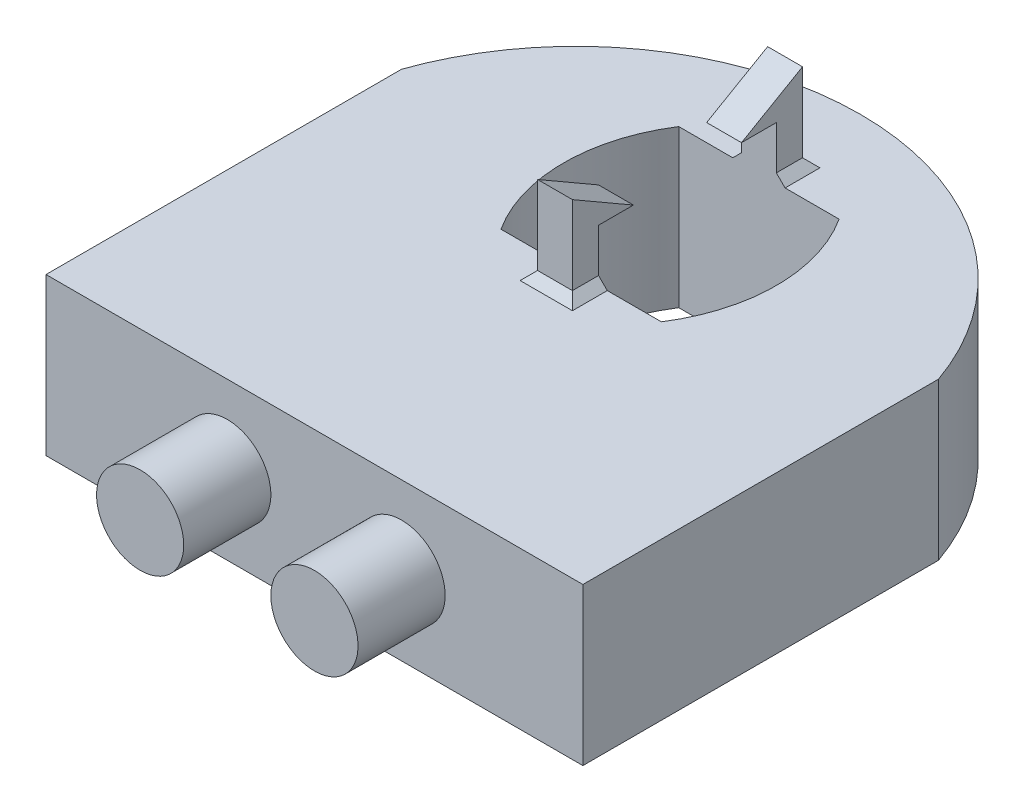
ISO-10303-21;
HEADER;
FILE_DESCRIPTION(('STEP AP214'),'2;1');
FILE_NAME('part.step','',(''),(''),'','','');
FILE_SCHEMA(('AUTOMOTIVE_DESIGN { 1 0 10303 214 1 1 1 1 }'));
ENDSEC;
DATA;
#1=APPLICATION_CONTEXT('core data for automotive mechanical design processes');
#2=APPLICATION_PROTOCOL_DEFINITION('international standard','automotive_design',2000,#1);
#3=PRODUCT_CONTEXT('',#1,'mechanical');
#4=PRODUCT('Part','Part','',(#3));
#5=PRODUCT_RELATED_PRODUCT_CATEGORY('part','',(#4));
#6=PRODUCT_DEFINITION_FORMATION('','',#4);
#7=PRODUCT_DEFINITION_CONTEXT('part definition',#1,'design');
#8=PRODUCT_DEFINITION('design','',#6,#7);
#9=PRODUCT_DEFINITION_SHAPE('','',#8);
#10=(LENGTH_UNIT() NAMED_UNIT(*) SI_UNIT(.MILLI.,.METRE.));
#11=(NAMED_UNIT(*) PLANE_ANGLE_UNIT() SI_UNIT($,.RADIAN.));
#12=(NAMED_UNIT(*) SI_UNIT($,.STERADIAN.) SOLID_ANGLE_UNIT());
#13=UNCERTAINTY_MEASURE_WITH_UNIT(LENGTH_MEASURE(1.E-05),#10,'distance_accuracy_value','');
#14=(GEOMETRIC_REPRESENTATION_CONTEXT(3) GLOBAL_UNCERTAINTY_ASSIGNED_CONTEXT((#13)) GLOBAL_UNIT_ASSIGNED_CONTEXT((#10,
#11,#12)) REPRESENTATION_CONTEXT('',''));
#15=CARTESIAN_POINT('',(0.,0.,0.));
#16=DIRECTION('',(0.,0.,1.));
#17=DIRECTION('',(1.,0.,0.));
#18=AXIS2_PLACEMENT_3D('',#15,#16,#17);
#19=CARTESIAN_POINT('',(0.,9.,0.));
#20=DIRECTION('',(0.,1.,0.));
#21=DIRECTION('',(0.,0.,1.));
#22=AXIS2_PLACEMENT_3D('',#19,#20,#21);
#23=PLANE('',#22);
#24=CARTESIAN_POINT('',(15.4,9.,-15.));
#25=DIRECTION('',(0.,1.,0.));
#26=DIRECTION('',(0.,0.,1.));
#27=AXIS2_PLACEMENT_3D('',#24,#25,#26);
#28=CIRCLE('',#27,16.3193137110603);
#29=CARTESIAN_POINT('',(0.,9.,-20.4));
#30=VERTEX_POINT('',#29);
#31=CARTESIAN_POINT('',(30.8,9.,-20.4));
#32=VERTEX_POINT('',#31);
#33=EDGE_CURVE('E307',#30,#32,#28,.F.);
#34=ORIENTED_EDGE('',*,*,#33,.F.);
#35=DIRECTION('',(0.,0.,-1.));
#36=VECTOR('',#35,1.);
#37=CARTESIAN_POINT('',(0.,9.,0.));
#38=LINE('',#37,#36);
#39=CARTESIAN_POINT('',(0.,9.,0.));
#40=VERTEX_POINT('',#39);
#41=EDGE_CURVE('E311',#40,#30,#38,.T.);
#42=ORIENTED_EDGE('',*,*,#41,.F.);
#43=DIRECTION('',(1.,0.,0.));
#44=VECTOR('',#43,1.);
#45=CARTESIAN_POINT('',(0.,9.,0.));
#46=LINE('',#45,#44);
#47=CARTESIAN_POINT('',(30.8,9.,0.));
#48=VERTEX_POINT('',#47);
#49=EDGE_CURVE('E315',#40,#48,#46,.T.);
#50=ORIENTED_EDGE('',*,*,#49,.T.);
#51=DIRECTION('',(0.,0.,-1.));
#52=VECTOR('',#51,1.);
#53=CARTESIAN_POINT('',(30.8,9.,0.));
#54=LINE('',#53,#52);
#55=EDGE_CURVE('E319',#48,#32,#54,.T.);
#56=ORIENTED_EDGE('',*,*,#55,.T.);
#57=EDGE_LOOP('',(#34,#42,#50,#56));
#58=FACE_BOUND('',#57,.T.);
#59=DIRECTION('',(1.,0.,0.));
#60=VECTOR('',#59,1.);
#61=CARTESIAN_POINT('',(0.,9.,-27.5));
#62=LINE('',#61,#60);
#63=CARTESIAN_POINT('',(13.9,9.,-27.5));
#64=VERTEX_POINT('',#63);
#65=CARTESIAN_POINT('',(16.9,9.,-27.5));
#66=VERTEX_POINT('',#65);
#67=EDGE_CURVE('E402',#64,#66,#62,.T.);
#68=ORIENTED_EDGE('',*,*,#67,.T.);
#69=DIRECTION('',(0.,0.,1.));
#70=VECTOR('',#69,1.);
#71=CARTESIAN_POINT('',(16.9,9.,0.));
#72=LINE('',#71,#70);
#73=CARTESIAN_POINT('',(16.9,9.,-25.5));
#74=VERTEX_POINT('',#73);
#75=EDGE_CURVE('E405',#66,#74,#72,.T.);
#76=ORIENTED_EDGE('',*,*,#75,.T.);
#77=DIRECTION('',(1.,0.,0.));
#78=VECTOR('',#77,1.);
#79=CARTESIAN_POINT('',(0.,9.,-25.5));
#80=LINE('',#79,#78);
#81=CARTESIAN_POINT('',(20.,9.,-25.5));
#82=VERTEX_POINT('',#81);
#83=EDGE_CURVE('E302',#74,#82,#80,.T.);
#84=ORIENTED_EDGE('',*,*,#83,.T.);
#85=CARTESIAN_POINT('',(12.08,9.,-20.4));
#86=DIRECTION('',(0.,1.,0.));
#87=DIRECTION('',(0.,0.,1.));
#88=AXIS2_PLACEMENT_3D('',#85,#86,#87);
#89=CIRCLE('',#88,9.42000000000002);
#90=CARTESIAN_POINT('',(20.,9.,-15.3));
#91=VERTEX_POINT('',#90);
#92=EDGE_CURVE('E288',#82,#91,#89,.F.);
#93=ORIENTED_EDGE('',*,*,#92,.T.);
#94=DIRECTION('',(1.,0.,0.));
#95=VECTOR('',#94,1.);
#96=CARTESIAN_POINT('',(0.,9.,-15.3));
#97=LINE('',#96,#95);
#98=CARTESIAN_POINT('',(16.9,9.,-15.3));
#99=VERTEX_POINT('',#98);
#100=EDGE_CURVE('E292',#99,#91,#97,.T.);
#101=ORIENTED_EDGE('',*,*,#100,.F.);
#102=DIRECTION('',(0.,0.,1.));
#103=VECTOR('',#102,1.);
#104=CARTESIAN_POINT('',(16.9,9.,-13.8));
#105=LINE('',#104,#103);
#106=CARTESIAN_POINT('',(16.9,9.,-13.3));
#107=VERTEX_POINT('',#106);
#108=EDGE_CURVE('E389',#99,#107,#105,.T.);
#109=ORIENTED_EDGE('',*,*,#108,.T.);
#110=DIRECTION('',(-1.,0.,0.));
#111=VECTOR('',#110,1.);
#112=CARTESIAN_POINT('',(0.,9.,-13.3));
#113=LINE('',#112,#111);
#114=CARTESIAN_POINT('',(13.9,9.,-13.3));
#115=VERTEX_POINT('',#114);
#116=EDGE_CURVE('E392',#107,#115,#113,.T.);
#117=ORIENTED_EDGE('',*,*,#116,.T.);
#118=DIRECTION('',(0.,0.,-1.));
#119=VECTOR('',#118,1.);
#120=CARTESIAN_POINT('',(13.9,9.,0.));
#121=LINE('',#120,#119);
#122=CARTESIAN_POINT('',(13.9,9.,-15.3));
#123=VERTEX_POINT('',#122);
#124=EDGE_CURVE('E395',#115,#123,#121,.T.);
#125=ORIENTED_EDGE('',*,*,#124,.T.);
#126=CARTESIAN_POINT('',(10.8,9.,-15.3));
#127=VERTEX_POINT('',#126);
#128=EDGE_CURVE('E294',#127,#123,#97,.T.);
#129=ORIENTED_EDGE('',*,*,#128,.F.);
#130=CARTESIAN_POINT('',(18.72,9.,-20.4));
#131=DIRECTION('',(0.,1.,0.));
#132=DIRECTION('',(0.,0.,1.));
#133=AXIS2_PLACEMENT_3D('',#130,#131,#132);
#134=CIRCLE('',#133,9.42000000000002);
#135=CARTESIAN_POINT('',(10.8,9.,-25.5));
#136=VERTEX_POINT('',#135);
#137=EDGE_CURVE('E298',#136,#127,#134,.T.);
#138=ORIENTED_EDGE('',*,*,#137,.F.);
#139=CARTESIAN_POINT('',(13.9,9.,-25.5));
#140=VERTEX_POINT('',#139);
#141=EDGE_CURVE('E303',#136,#140,#80,.T.);
#142=ORIENTED_EDGE('',*,*,#141,.T.);
#143=DIRECTION('',(0.,0.,-1.));
#144=VECTOR('',#143,1.);
#145=CARTESIAN_POINT('',(13.9,9.,-27.));
#146=LINE('',#145,#144);
#147=EDGE_CURVE('E399',#140,#64,#146,.T.);
#148=ORIENTED_EDGE('',*,*,#147,.T.);
#149=EDGE_LOOP('',(#68,#76,#84,#93,#101,#109,#117,#125,#129,#138,#142,#148));
#150=FACE_BOUND('',#149,.T.);
#151=ADVANCED_FACE('F49',(#58,#150),#23,.T.);
#152=CARTESIAN_POINT('',(15.4,9.,-15.));
#153=DIRECTION('',(0.,-1.,0.));
#154=DIRECTION('',(0.,0.,-1.));
#155=AXIS2_PLACEMENT_3D('',#152,#153,#154);
#156=CYLINDRICAL_SURFACE('',#155,16.3193137110603);
#157=CARTESIAN_POINT('',(15.4,0.,-15.));
#158=DIRECTION('',(0.,1.,0.));
#159=DIRECTION('',(0.,0.,1.));
#160=AXIS2_PLACEMENT_3D('',#157,#158,#159);
#161=CIRCLE('',#160,16.3193137110603);
#162=CARTESIAN_POINT('',(0.,0.,-20.4));
#163=VERTEX_POINT('',#162);
#164=CARTESIAN_POINT('',(30.8,0.,-20.4));
#165=VERTEX_POINT('',#164);
#166=EDGE_CURVE('E337',#163,#165,#161,.F.);
#167=ORIENTED_EDGE('',*,*,#166,.F.);
#168=DIRECTION('',(0.,-1.,0.));
#169=VECTOR('',#168,1.);
#170=CARTESIAN_POINT('',(0.,9.,-20.4));
#171=LINE('',#170,#169);
#172=EDGE_CURVE('E363',#30,#163,#171,.T.);
#173=ORIENTED_EDGE('',*,*,#172,.F.);
#174=ORIENTED_EDGE('',*,*,#33,.T.);
#175=DIRECTION('',(0.,-1.,0.));
#176=VECTOR('',#175,1.);
#177=CARTESIAN_POINT('',(30.8,9.,-20.4));
#178=LINE('',#177,#176);
#179=EDGE_CURVE('E352',#32,#165,#178,.T.);
#180=ORIENTED_EDGE('',*,*,#179,.T.);
#181=EDGE_LOOP('',(#167,#173,#174,#180));
#182=FACE_BOUND('',#181,.T.);
#183=ADVANCED_FACE('F494',(#182),#156,.T.);
#184=CARTESIAN_POINT('',(0.,9.,0.));
#185=DIRECTION('',(-1.,0.,0.));
#186=DIRECTION('',(0.,0.,1.));
#187=AXIS2_PLACEMENT_3D('',#184,#185,#186);
#188=PLANE('',#187);
#189=DIRECTION('',(0.,0.,-1.));
#190=VECTOR('',#189,1.);
#191=CARTESIAN_POINT('',(0.,0.,0.));
#192=LINE('',#191,#190);
#193=CARTESIAN_POINT('',(0.,0.,0.));
#194=VERTEX_POINT('',#193);
#195=EDGE_CURVE('E341',#194,#163,#192,.T.);
#196=ORIENTED_EDGE('',*,*,#195,.F.);
#197=DIRECTION('',(0.,-1.,0.));
#198=VECTOR('',#197,1.);
#199=CARTESIAN_POINT('',(0.,9.,0.));
#200=LINE('',#199,#198);
#201=EDGE_CURVE('E360',#40,#194,#200,.T.);
#202=ORIENTED_EDGE('',*,*,#201,.F.);
#203=ORIENTED_EDGE('',*,*,#41,.T.);
#204=ORIENTED_EDGE('',*,*,#172,.T.);
#205=EDGE_LOOP('',(#196,#202,#203,#204));
#206=FACE_BOUND('',#205,.T.);
#207=ADVANCED_FACE('F502',(#206),#188,.T.);
#208=CARTESIAN_POINT('',(0.,9.,0.));
#209=DIRECTION('',(0.,0.,-1.));
#210=DIRECTION('',(-1.,0.,0.));
#211=AXIS2_PLACEMENT_3D('',#208,#209,#210);
#212=PLANE('',#211);
#213=CARTESIAN_POINT('',(20.4,4.5,0.));
#214=DIRECTION('',(0.,0.,-1.));
#215=DIRECTION('',(-1.,0.,0.));
#216=AXIS2_PLACEMENT_3D('',#213,#214,#215);
#217=CIRCLE('',#216,2.5);
#218=CARTESIAN_POINT('',(17.9,4.5,0.));
#219=VERTEX_POINT('',#218);
#220=EDGE_CURVE('E381',#219,#219,#217,.F.);
#221=ORIENTED_EDGE('',*,*,#220,.F.);
#222=EDGE_LOOP('',(#221));
#223=FACE_BOUND('',#222,.T.);
#224=CARTESIAN_POINT('',(10.4,4.5,0.));
#225=DIRECTION('',(0.,0.,-1.));
#226=DIRECTION('',(-1.,0.,0.));
#227=AXIS2_PLACEMENT_3D('',#224,#225,#226);
#228=CIRCLE('',#227,2.5);
#229=CARTESIAN_POINT('',(7.9,4.5,0.));
#230=VERTEX_POINT('',#229);
#231=EDGE_CURVE('E366',#230,#230,#228,.F.);
#232=ORIENTED_EDGE('',*,*,#231,.F.);
#233=EDGE_LOOP('',(#232));
#234=FACE_BOUND('',#233,.T.);
#235=DIRECTION('',(1.,0.,0.));
#236=VECTOR('',#235,1.);
#237=CARTESIAN_POINT('',(0.,0.,0.));
#238=LINE('',#237,#236);
#239=CARTESIAN_POINT('',(30.8,0.,0.));
#240=VERTEX_POINT('',#239);
#241=EDGE_CURVE('E345',#194,#240,#238,.T.);
#242=ORIENTED_EDGE('',*,*,#241,.T.);
#243=DIRECTION('',(0.,-1.,0.));
#244=VECTOR('',#243,1.);
#245=CARTESIAN_POINT('',(30.8,9.,0.));
#246=LINE('',#245,#244);
#247=EDGE_CURVE('E355',#48,#240,#246,.T.);
#248=ORIENTED_EDGE('',*,*,#247,.F.);
#249=ORIENTED_EDGE('',*,*,#49,.F.);
#250=ORIENTED_EDGE('',*,*,#201,.T.);
#251=EDGE_LOOP('',(#242,#248,#249,#250));
#252=FACE_BOUND('',#251,.T.);
#253=ADVANCED_FACE('F516',(#223,#234,#252),#212,.F.);
#254=CARTESIAN_POINT('',(12.08,9.,-20.4));
#255=DIRECTION('',(0.,-1.,0.));
#256=DIRECTION('',(0.,0.,-1.));
#257=AXIS2_PLACEMENT_3D('',#254,#255,#256);
#258=CYLINDRICAL_SURFACE('',#257,9.42000000000002);
#259=CARTESIAN_POINT('',(12.08,0.,-20.4));
#260=DIRECTION('',(0.,1.,0.));
#261=DIRECTION('',(0.,0.,1.));
#262=AXIS2_PLACEMENT_3D('',#259,#260,#261);
#263=CIRCLE('',#262,9.42000000000002);
#264=CARTESIAN_POINT('',(20.,0.,-25.5));
#265=VERTEX_POINT('',#264);
#266=CARTESIAN_POINT('',(20.,0.,-15.3));
#267=VERTEX_POINT('',#266);
#268=EDGE_CURVE('E287',#265,#267,#263,.F.);
#269=ORIENTED_EDGE('',*,*,#268,.T.);
#270=DIRECTION('',(0.,-1.,0.));
#271=VECTOR('',#270,1.);
#272=CARTESIAN_POINT('',(20.,9.,-15.3));
#273=LINE('',#272,#271);
#274=EDGE_CURVE('E356',#91,#267,#273,.T.);
#275=ORIENTED_EDGE('',*,*,#274,.F.);
#276=ORIENTED_EDGE('',*,*,#92,.F.);
#277=DIRECTION('',(0.,-1.,0.));
#278=VECTOR('',#277,1.);
#279=CARTESIAN_POINT('',(20.,9.,-25.5));
#280=LINE('',#279,#278);
#281=EDGE_CURVE('E322',#82,#265,#280,.T.);
#282=ORIENTED_EDGE('',*,*,#281,.T.);
#283=EDGE_LOOP('',(#269,#275,#276,#282));
#284=FACE_BOUND('',#283,.T.);
#285=ADVANCED_FACE('F468',(#284),#258,.F.);
#286=CARTESIAN_POINT('',(0.,9.,-15.3));
#287=DIRECTION('',(0.,0.,-1.));
#288=DIRECTION('',(-1.,0.,0.));
#289=AXIS2_PLACEMENT_3D('',#286,#287,#288);
#290=PLANE('',#289);
#291=DIRECTION('',(1.,0.,0.));
#292=VECTOR('',#291,1.);
#293=CARTESIAN_POINT('',(0.,0.,-15.3));
#294=LINE('',#293,#292);
#295=CARTESIAN_POINT('',(10.8,0.,-15.3));
#296=VERTEX_POINT('',#295);
#297=EDGE_CURVE('E326',#296,#267,#294,.T.);
#298=ORIENTED_EDGE('',*,*,#297,.F.);
#299=DIRECTION('',(0.,-1.,0.));
#300=VECTOR('',#299,1.);
#301=CARTESIAN_POINT('',(10.8,9.,-15.3));
#302=LINE('',#301,#300);
#303=EDGE_CURVE('E373',#127,#296,#302,.T.);
#304=ORIENTED_EDGE('',*,*,#303,.F.);
#305=ORIENTED_EDGE('',*,*,#128,.T.);
#306=DIRECTION('',(0.707106781186543,0.707106781186552,0.));
#307=VECTOR('',#306,1.);
#308=CARTESIAN_POINT('',(13.9,9.,-15.3));
#309=LINE('',#308,#307);
#310=CARTESIAN_POINT('',(14.4,9.50000000000001,-15.3));
#311=VERTEX_POINT('',#310);
#312=EDGE_CURVE('E60',#123,#311,#309,.T.);
#313=ORIENTED_EDGE('',*,*,#312,.T.);
#314=DIRECTION('',(0.,1.,0.));
#315=VECTOR('',#314,1.);
#316=CARTESIAN_POINT('',(14.4,9.,-15.3));
#317=LINE('',#316,#315);
#318=CARTESIAN_POINT('',(14.4,12.,-15.3));
#319=VERTEX_POINT('',#318);
#320=EDGE_CURVE('E244',#311,#319,#317,.T.);
#321=ORIENTED_EDGE('',*,*,#320,.T.);
#322=DIRECTION('',(-1.,0.,0.));
#323=VECTOR('',#322,1.);
#324=CARTESIAN_POINT('',(16.4,12.,-15.3));
#325=LINE('',#324,#323);
#326=CARTESIAN_POINT('',(16.4,12.,-15.3));
#327=VERTEX_POINT('',#326);
#328=EDGE_CURVE('E283',#327,#319,#325,.T.);
#329=ORIENTED_EDGE('',*,*,#328,.F.);
#330=DIRECTION('',(0.,1.,0.));
#331=VECTOR('',#330,1.);
#332=CARTESIAN_POINT('',(16.4,9.,-15.3));
#333=LINE('',#332,#331);
#334=CARTESIAN_POINT('',(16.4,9.50000000000001,-15.3));
#335=VERTEX_POINT('',#334);
#336=EDGE_CURVE('E252',#335,#327,#333,.T.);
#337=ORIENTED_EDGE('',*,*,#336,.F.);
#338=DIRECTION('',(-0.707106781186543,0.707106781186552,0.));
#339=VECTOR('',#338,1.);
#340=CARTESIAN_POINT('',(16.4,9.50000000000001,-15.3));
#341=LINE('',#340,#339);
#342=EDGE_CURVE('E11',#335,#99,#341,.F.);
#343=ORIENTED_EDGE('',*,*,#342,.T.);
#344=ORIENTED_EDGE('',*,*,#100,.T.);
#345=ORIENTED_EDGE('',*,*,#274,.T.);
#346=EDGE_LOOP('',(#298,#304,#305,#313,#321,#329,#337,#343,#344,#345));
#347=FACE_BOUND('',#346,.T.);
#348=ADVANCED_FACE('F454',(#347),#290,.T.);
#349=CARTESIAN_POINT('',(18.72,9.,-20.4));
#350=DIRECTION('',(0.,-1.,0.));
#351=DIRECTION('',(0.,0.,-1.));
#352=AXIS2_PLACEMENT_3D('',#349,#350,#351);
#353=CYLINDRICAL_SURFACE('',#352,9.42000000000002);
#354=CARTESIAN_POINT('',(18.72,0.,-20.4));
#355=DIRECTION('',(0.,1.,0.));
#356=DIRECTION('',(0.,0.,1.));
#357=AXIS2_PLACEMENT_3D('',#354,#355,#356);
#358=CIRCLE('',#357,9.42000000000002);
#359=CARTESIAN_POINT('',(10.8,0.,-25.5));
#360=VERTEX_POINT('',#359);
#361=EDGE_CURVE('E330',#360,#296,#358,.T.);
#362=ORIENTED_EDGE('',*,*,#361,.F.);
#363=DIRECTION('',(0.,-1.,0.));
#364=VECTOR('',#363,1.);
#365=CARTESIAN_POINT('',(10.8,9.,-25.5));
#366=LINE('',#365,#364);
#367=EDGE_CURVE('E370',#136,#360,#366,.T.);
#368=ORIENTED_EDGE('',*,*,#367,.F.);
#369=ORIENTED_EDGE('',*,*,#137,.T.);
#370=ORIENTED_EDGE('',*,*,#303,.T.);
#371=EDGE_LOOP('',(#362,#368,#369,#370));
#372=FACE_BOUND('',#371,.T.);
#373=ADVANCED_FACE('F475',(#372),#353,.F.);
#374=CARTESIAN_POINT('',(0.,9.,-25.5));
#375=DIRECTION('',(0.,0.,-1.));
#376=DIRECTION('',(-1.,0.,0.));
#377=AXIS2_PLACEMENT_3D('',#374,#375,#376);
#378=PLANE('',#377);
#379=DIRECTION('',(1.,0.,0.));
#380=VECTOR('',#379,1.);
#381=CARTESIAN_POINT('',(0.,0.,-25.5));
#382=LINE('',#381,#380);
#383=EDGE_CURVE('E334',#360,#265,#382,.T.);
#384=ORIENTED_EDGE('',*,*,#383,.T.);
#385=ORIENTED_EDGE('',*,*,#281,.F.);
#386=ORIENTED_EDGE('',*,*,#83,.F.);
#387=DIRECTION('',(-0.707106781186552,0.707106781186543,0.));
#388=VECTOR('',#387,1.);
#389=CARTESIAN_POINT('',(8.44999999999988,17.45,-25.5));
#390=LINE('',#389,#388);
#391=CARTESIAN_POINT('',(16.4,9.5,-25.5));
#392=VERTEX_POINT('',#391);
#393=EDGE_CURVE('E420',#74,#392,#390,.T.);
#394=ORIENTED_EDGE('',*,*,#393,.T.);
#395=DIRECTION('',(0.,-1.,0.));
#396=VECTOR('',#395,1.);
#397=CARTESIAN_POINT('',(16.4,9.,-25.5));
#398=LINE('',#397,#396);
#399=CARTESIAN_POINT('',(16.4,12.,-25.5));
#400=VERTEX_POINT('',#399);
#401=EDGE_CURVE('E224',#400,#392,#398,.T.);
#402=ORIENTED_EDGE('',*,*,#401,.F.);
#403=DIRECTION('',(-1.,0.,0.));
#404=VECTOR('',#403,1.);
#405=CARTESIAN_POINT('',(16.4,12.,-25.5));
#406=LINE('',#405,#404);
#407=CARTESIAN_POINT('',(14.4,12.,-25.5));
#408=VERTEX_POINT('',#407);
#409=EDGE_CURVE('E208',#400,#408,#406,.T.);
#410=ORIENTED_EDGE('',*,*,#409,.T.);
#411=DIRECTION('',(0.,-1.,0.));
#412=VECTOR('',#411,1.);
#413=CARTESIAN_POINT('',(14.4,9.,-25.5));
#414=LINE('',#413,#412);
#415=CARTESIAN_POINT('',(14.4,9.5,-25.5));
#416=VERTEX_POINT('',#415);
#417=EDGE_CURVE('E217',#408,#416,#414,.T.);
#418=ORIENTED_EDGE('',*,*,#417,.T.);
#419=DIRECTION('',(0.707106781186552,0.707106781186543,0.));
#420=VECTOR('',#419,1.);
#421=CARTESIAN_POINT('',(6.9499999999999,2.05000000000001,-25.5));
#422=LINE('',#421,#420);
#423=EDGE_CURVE('E423',#416,#140,#422,.F.);
#424=ORIENTED_EDGE('',*,*,#423,.T.);
#425=ORIENTED_EDGE('',*,*,#141,.F.);
#426=ORIENTED_EDGE('',*,*,#367,.T.);
#427=EDGE_LOOP('',(#384,#385,#386,#394,#402,#410,#418,#424,#425,#426));
#428=FACE_BOUND('',#427,.T.);
#429=ADVANCED_FACE('F221',(#428),#378,.F.);
#430=CARTESIAN_POINT('',(30.8,9.,0.));
#431=DIRECTION('',(-1.,0.,0.));
#432=DIRECTION('',(0.,0.,1.));
#433=AXIS2_PLACEMENT_3D('',#430,#431,#432);
#434=PLANE('',#433);
#435=DIRECTION('',(0.,0.,-1.));
#436=VECTOR('',#435,1.);
#437=CARTESIAN_POINT('',(30.8,0.,0.));
#438=LINE('',#437,#436);
#439=EDGE_CURVE('E293',#240,#165,#438,.T.);
#440=ORIENTED_EDGE('',*,*,#439,.T.);
#441=ORIENTED_EDGE('',*,*,#179,.F.);
#442=ORIENTED_EDGE('',*,*,#55,.F.);
#443=ORIENTED_EDGE('',*,*,#247,.T.);
#444=EDGE_LOOP('',(#440,#441,#442,#443));
#445=FACE_BOUND('',#444,.T.);
#446=ADVANCED_FACE('F512',(#445),#434,.F.);
#447=CARTESIAN_POINT('',(0.,0.,0.));
#448=DIRECTION('',(0.,1.,0.));
#449=DIRECTION('',(0.,0.,1.));
#450=AXIS2_PLACEMENT_3D('',#447,#448,#449);
#451=PLANE('',#450);
#452=ORIENTED_EDGE('',*,*,#268,.F.);
#453=ORIENTED_EDGE('',*,*,#383,.F.);
#454=ORIENTED_EDGE('',*,*,#361,.T.);
#455=ORIENTED_EDGE('',*,*,#297,.T.);
#456=EDGE_LOOP('',(#452,#453,#454,#455));
#457=FACE_BOUND('',#456,.T.);
#458=ORIENTED_EDGE('',*,*,#166,.T.);
#459=ORIENTED_EDGE('',*,*,#439,.F.);
#460=ORIENTED_EDGE('',*,*,#241,.F.);
#461=ORIENTED_EDGE('',*,*,#195,.T.);
#462=EDGE_LOOP('',(#458,#459,#460,#461));
#463=FACE_BOUND('',#462,.T.);
#464=ADVANCED_FACE('F472',(#457,#463),#451,.F.);
#465=CARTESIAN_POINT('',(16.4,12.,-15.3));
#466=DIRECTION('',(0.,1.,0.));
#467=DIRECTION('',(0.,0.,1.));
#468=AXIS2_PLACEMENT_3D('',#465,#466,#467);
#469=PLANE('',#468);
#470=DIRECTION('',(0.,0.,-1.));
#471=VECTOR('',#470,1.);
#472=CARTESIAN_POINT('',(14.4,12.,-15.3));
#473=LINE('',#472,#471);
#474=CARTESIAN_POINT('',(14.4,12.,-17.3));
#475=VERTEX_POINT('',#474);
#476=EDGE_CURVE('E268',#319,#475,#473,.T.);
#477=ORIENTED_EDGE('',*,*,#476,.T.);
#478=DIRECTION('',(-1.,0.,0.));
#479=VECTOR('',#478,1.);
#480=CARTESIAN_POINT('',(16.4,12.,-17.3));
#481=LINE('',#480,#479);
#482=CARTESIAN_POINT('',(16.4,12.,-17.3));
#483=VERTEX_POINT('',#482);
#484=EDGE_CURVE('E279',#483,#475,#481,.T.);
#485=ORIENTED_EDGE('',*,*,#484,.F.);
#486=DIRECTION('',(0.,0.,-1.));
#487=VECTOR('',#486,1.);
#488=CARTESIAN_POINT('',(16.4,12.,-15.3));
#489=LINE('',#488,#487);
#490=EDGE_CURVE('E255',#327,#483,#489,.T.);
#491=ORIENTED_EDGE('',*,*,#490,.F.);
#492=ORIENTED_EDGE('',*,*,#328,.T.);
#493=EDGE_LOOP('',(#477,#485,#491,#492));
#494=FACE_BOUND('',#493,.T.);
#495=ADVANCED_FACE('F508',(#494),#469,.F.);
#496=CARTESIAN_POINT('',(16.4,12.,-17.3));
#497=DIRECTION('',(0.,-0.866025403784442,0.499999999999995));
#498=DIRECTION('',(0.,-0.499999999999995,-0.866025403784442));
#499=AXIS2_PLACEMENT_3D('',#496,#497,#498);
#500=PLANE('',#499);
#501=DIRECTION('',(0.,0.499999999999995,0.866025403784442));
#502=VECTOR('',#501,1.);
#503=CARTESIAN_POINT('',(14.4,12.,-17.3));
#504=LINE('',#503,#502);
#505=CARTESIAN_POINT('',(14.4,14.0207259421637,-13.8));
#506=VERTEX_POINT('',#505);
#507=EDGE_CURVE('E271',#475,#506,#504,.T.);
#508=ORIENTED_EDGE('',*,*,#507,.T.);
#509=DIRECTION('',(-1.,0.,0.));
#510=VECTOR('',#509,1.);
#511=CARTESIAN_POINT('',(16.4,14.0207259421637,-13.8));
#512=LINE('',#511,#510);
#513=CARTESIAN_POINT('',(16.4,14.0207259421637,-13.8));
#514=VERTEX_POINT('',#513);
#515=EDGE_CURVE('E265',#514,#506,#512,.T.);
#516=ORIENTED_EDGE('',*,*,#515,.F.);
#517=DIRECTION('',(0.,0.499999999999995,0.866025403784442));
#518=VECTOR('',#517,1.);
#519=CARTESIAN_POINT('',(16.4,12.,-17.3));
#520=LINE('',#519,#518);
#521=EDGE_CURVE('E259',#483,#514,#520,.T.);
#522=ORIENTED_EDGE('',*,*,#521,.F.);
#523=ORIENTED_EDGE('',*,*,#484,.T.);
#524=EDGE_LOOP('',(#508,#516,#522,#523));
#525=FACE_BOUND('',#524,.T.);
#526=ADVANCED_FACE('F627',(#525),#500,.F.);
#527=CARTESIAN_POINT('',(16.4,14.0207259421637,-13.8));
#528=DIRECTION('',(0.,0.,-1.));
#529=DIRECTION('',(-1.,0.,0.));
#530=AXIS2_PLACEMENT_3D('',#527,#528,#529);
#531=PLANE('',#530);
#532=DIRECTION('',(0.,-1.,0.));
#533=VECTOR('',#532,1.);
#534=CARTESIAN_POINT('',(14.4,14.0207259421637,-13.8));
#535=LINE('',#534,#533);
#536=CARTESIAN_POINT('',(14.4,9.50000000000001,-13.8));
#537=VERTEX_POINT('',#536);
#538=EDGE_CURVE('E256',#506,#537,#535,.T.);
#539=ORIENTED_EDGE('',*,*,#538,.T.);
#540=DIRECTION('',(1.,0.,0.));
#541=VECTOR('',#540,1.);
#542=CARTESIAN_POINT('',(16.4,9.50000000000001,-13.8));
#543=LINE('',#542,#541);
#544=CARTESIAN_POINT('',(16.4,9.50000000000001,-13.8));
#545=VERTEX_POINT('',#544);
#546=EDGE_CURVE('E76',#537,#545,#543,.T.);
#547=ORIENTED_EDGE('',*,*,#546,.T.);
#548=DIRECTION('',(0.,-1.,0.));
#549=VECTOR('',#548,1.);
#550=CARTESIAN_POINT('',(16.4,14.0207259421637,-13.8));
#551=LINE('',#550,#549);
#552=EDGE_CURVE('E262',#514,#545,#551,.T.);
#553=ORIENTED_EDGE('',*,*,#552,.F.);
#554=ORIENTED_EDGE('',*,*,#515,.T.);
#555=EDGE_LOOP('',(#539,#547,#553,#554));
#556=FACE_BOUND('',#555,.T.);
#557=ADVANCED_FACE('F623',(#556),#531,.F.);
#558=CARTESIAN_POINT('',(16.4,0.,0.));
#559=DIRECTION('',(1.,0.,0.));
#560=DIRECTION('',(0.,0.,-1.));
#561=AXIS2_PLACEMENT_3D('',#558,#559,#560);
#562=PLANE('',#561);
#563=ORIENTED_EDGE('',*,*,#552,.T.);
#564=DIRECTION('',(0.,0.,-1.));
#565=VECTOR('',#564,1.);
#566=CARTESIAN_POINT('',(16.4,9.50000000000001,-15.3));
#567=LINE('',#566,#565);
#568=EDGE_CURVE('E68',#545,#335,#567,.T.);
#569=ORIENTED_EDGE('',*,*,#568,.T.);
#570=ORIENTED_EDGE('',*,*,#336,.T.);
#571=ORIENTED_EDGE('',*,*,#490,.T.);
#572=ORIENTED_EDGE('',*,*,#521,.T.);
#573=EDGE_LOOP('',(#563,#569,#570,#571,#572));
#574=FACE_BOUND('',#573,.T.);
#575=ADVANCED_FACE('F620',(#574),#562,.T.);
#576=CARTESIAN_POINT('',(14.4,0.,0.));
#577=DIRECTION('',(1.,0.,0.));
#578=DIRECTION('',(0.,0.,-1.));
#579=AXIS2_PLACEMENT_3D('',#576,#577,#578);
#580=PLANE('',#579);
#581=ORIENTED_EDGE('',*,*,#320,.F.);
#582=DIRECTION('',(0.,0.,1.));
#583=VECTOR('',#582,1.);
#584=CARTESIAN_POINT('',(14.4,9.50000000000001,0.));
#585=LINE('',#584,#583);
#586=EDGE_CURVE('E413',#311,#537,#585,.T.);
#587=ORIENTED_EDGE('',*,*,#586,.T.);
#588=ORIENTED_EDGE('',*,*,#538,.F.);
#589=ORIENTED_EDGE('',*,*,#507,.F.);
#590=ORIENTED_EDGE('',*,*,#476,.F.);
#591=EDGE_LOOP('',(#581,#587,#588,#589,#590));
#592=FACE_BOUND('',#591,.T.);
#593=ADVANCED_FACE('F482',(#592),#580,.F.);
#594=CARTESIAN_POINT('',(16.4,14.0207259421637,-27.));
#595=DIRECTION('',(0.,0.,1.));
#596=DIRECTION('',(1.,0.,0.));
#597=AXIS2_PLACEMENT_3D('',#594,#595,#596);
#598=PLANE('',#597);
#599=DIRECTION('',(0.,1.,0.));
#600=VECTOR('',#599,1.);
#601=CARTESIAN_POINT('',(16.4,14.0207259421637,-27.));
#602=LINE('',#601,#600);
#603=CARTESIAN_POINT('',(16.4,9.5,-27.));
#604=VERTEX_POINT('',#603);
#605=CARTESIAN_POINT('',(16.4,14.0207259421637,-27.));
#606=VERTEX_POINT('',#605);
#607=EDGE_CURVE('E232',#604,#606,#602,.T.);
#608=ORIENTED_EDGE('',*,*,#607,.F.);
#609=DIRECTION('',(-1.,0.,0.));
#610=VECTOR('',#609,1.);
#611=CARTESIAN_POINT('',(16.4,9.5,-27.));
#612=LINE('',#611,#610);
#613=CARTESIAN_POINT('',(14.4,9.5,-27.));
#614=VERTEX_POINT('',#613);
#615=EDGE_CURVE('E408',#604,#614,#612,.T.);
#616=ORIENTED_EDGE('',*,*,#615,.T.);
#617=DIRECTION('',(0.,1.,0.));
#618=VECTOR('',#617,1.);
#619=CARTESIAN_POINT('',(14.4,14.0207259421637,-27.));
#620=LINE('',#619,#618);
#621=CARTESIAN_POINT('',(14.4,14.0207259421637,-27.));
#622=VERTEX_POINT('',#621);
#623=EDGE_CURVE('E241',#614,#622,#620,.T.);
#624=ORIENTED_EDGE('',*,*,#623,.T.);
#625=DIRECTION('',(-1.,0.,0.));
#626=VECTOR('',#625,1.);
#627=CARTESIAN_POINT('',(16.4,14.0207259421637,-27.));
#628=LINE('',#627,#626);
#629=EDGE_CURVE('E568',#606,#622,#628,.T.);
#630=ORIENTED_EDGE('',*,*,#629,.F.);
#631=EDGE_LOOP('',(#608,#616,#624,#630));
#632=FACE_BOUND('',#631,.T.);
#633=ADVANCED_FACE('F566',(#632),#598,.F.);
#634=CARTESIAN_POINT('',(16.4,12.,-23.5));
#635=DIRECTION('',(0.,-0.866025403784442,-0.499999999999994));
#636=DIRECTION('',(0.,0.499999999999994,-0.866025403784442));
#637=AXIS2_PLACEMENT_3D('',#634,#635,#636);
#638=PLANE('',#637);
#639=DIRECTION('',(0.,-0.499999999999994,0.866025403784442));
#640=VECTOR('',#639,1.);
#641=CARTESIAN_POINT('',(14.4,12.,-23.5));
#642=LINE('',#641,#640);
#643=CARTESIAN_POINT('',(14.4,12.,-23.5));
#644=VERTEX_POINT('',#643);
#645=EDGE_CURVE('E216',#622,#644,#642,.T.);
#646=ORIENTED_EDGE('',*,*,#645,.T.);
#647=DIRECTION('',(-1.,0.,0.));
#648=VECTOR('',#647,1.);
#649=CARTESIAN_POINT('',(16.4,12.,-23.5));
#650=LINE('',#649,#648);
#651=CARTESIAN_POINT('',(16.4,12.,-23.5));
#652=VERTEX_POINT('',#651);
#653=EDGE_CURVE('E211',#652,#644,#650,.T.);
#654=ORIENTED_EDGE('',*,*,#653,.F.);
#655=DIRECTION('',(0.,-0.499999999999994,0.866025403784442));
#656=VECTOR('',#655,1.);
#657=CARTESIAN_POINT('',(16.4,12.,-23.5));
#658=LINE('',#657,#656);
#659=EDGE_CURVE('E235',#606,#652,#658,.T.);
#660=ORIENTED_EDGE('',*,*,#659,.F.);
#661=ORIENTED_EDGE('',*,*,#629,.T.);
#662=EDGE_LOOP('',(#646,#654,#660,#661));
#663=FACE_BOUND('',#662,.T.);
#664=ADVANCED_FACE('F574',(#663),#638,.F.);
#665=CARTESIAN_POINT('',(16.4,12.,-25.5));
#666=DIRECTION('',(0.,1.,0.));
#667=DIRECTION('',(0.,0.,1.));
#668=AXIS2_PLACEMENT_3D('',#665,#666,#667);
#669=PLANE('',#668);
#670=DIRECTION('',(0.,0.,-1.));
#671=VECTOR('',#670,1.);
#672=CARTESIAN_POINT('',(14.4,12.,-25.5));
#673=LINE('',#672,#671);
#674=EDGE_CURVE('E204',#644,#408,#673,.T.);
#675=ORIENTED_EDGE('',*,*,#674,.T.);
#676=ORIENTED_EDGE('',*,*,#409,.F.);
#677=DIRECTION('',(0.,0.,-1.));
#678=VECTOR('',#677,1.);
#679=CARTESIAN_POINT('',(16.4,12.,-25.5));
#680=LINE('',#679,#678);
#681=EDGE_CURVE('E247',#652,#400,#680,.T.);
#682=ORIENTED_EDGE('',*,*,#681,.F.);
#683=ORIENTED_EDGE('',*,*,#653,.T.);
#684=EDGE_LOOP('',(#675,#676,#682,#683));
#685=FACE_BOUND('',#684,.T.);
#686=ADVANCED_FACE('F206',(#685),#669,.F.);
#687=CARTESIAN_POINT('',(16.4,0.,0.));
#688=DIRECTION('',(-1.,0.,0.));
#689=DIRECTION('',(0.,0.,1.));
#690=AXIS2_PLACEMENT_3D('',#687,#688,#689);
#691=PLANE('',#690);
#692=ORIENTED_EDGE('',*,*,#401,.T.);
#693=DIRECTION('',(0.,0.,-1.));
#694=VECTOR('',#693,1.);
#695=CARTESIAN_POINT('',(16.4,9.5,0.));
#696=LINE('',#695,#694);
#697=EDGE_CURVE('E385',#392,#604,#696,.T.);
#698=ORIENTED_EDGE('',*,*,#697,.T.);
#699=ORIENTED_EDGE('',*,*,#607,.T.);
#700=ORIENTED_EDGE('',*,*,#659,.T.);
#701=ORIENTED_EDGE('',*,*,#681,.T.);
#702=EDGE_LOOP('',(#692,#698,#699,#700,#701));
#703=FACE_BOUND('',#702,.T.);
#704=ADVANCED_FACE('F564',(#703),#691,.F.);
#705=CARTESIAN_POINT('',(14.4,0.,0.));
#706=DIRECTION('',(-1.,0.,0.));
#707=DIRECTION('',(0.,0.,1.));
#708=AXIS2_PLACEMENT_3D('',#705,#706,#707);
#709=PLANE('',#708);
#710=ORIENTED_EDGE('',*,*,#623,.F.);
#711=DIRECTION('',(0.,0.,1.));
#712=VECTOR('',#711,1.);
#713=CARTESIAN_POINT('',(14.4,9.5,-25.5));
#714=LINE('',#713,#712);
#715=EDGE_CURVE('E230',#614,#416,#714,.T.);
#716=ORIENTED_EDGE('',*,*,#715,.T.);
#717=ORIENTED_EDGE('',*,*,#417,.F.);
#718=ORIENTED_EDGE('',*,*,#674,.F.);
#719=ORIENTED_EDGE('',*,*,#645,.F.);
#720=EDGE_LOOP('',(#710,#716,#717,#718,#719));
#721=FACE_BOUND('',#720,.T.);
#722=ADVANCED_FACE('F228',(#721),#709,.T.);
#723=CARTESIAN_POINT('',(10.4,4.5,5.));
#724=DIRECTION('',(0.,0.,-1.));
#725=DIRECTION('',(-1.,0.,0.));
#726=AXIS2_PLACEMENT_3D('',#723,#724,#725);
#727=CYLINDRICAL_SURFACE('',#726,2.5);
#728=CARTESIAN_POINT('',(10.4,4.5,5.));
#729=DIRECTION('',(0.,0.,1.));
#730=DIRECTION('',(1.,0.,0.));
#731=AXIS2_PLACEMENT_3D('',#728,#729,#730);
#732=CIRCLE('',#731,2.5);
#733=CARTESIAN_POINT('',(12.9,4.5,5.));
#734=VERTEX_POINT('',#733);
#735=EDGE_CURVE('E572',#734,#734,#732,.T.);
#736=ORIENTED_EDGE('',*,*,#735,.F.);
#737=EDGE_LOOP('',(#736));
#738=FACE_BOUND('',#737,.T.);
#739=ORIENTED_EDGE('',*,*,#231,.T.);
#740=EDGE_LOOP('',(#739));
#741=FACE_BOUND('',#740,.T.);
#742=ADVANCED_FACE('F600',(#738,#741),#727,.T.);
#743=CARTESIAN_POINT('',(10.4,4.5,5.));
#744=DIRECTION('',(0.,0.,1.));
#745=DIRECTION('',(1.,0.,0.));
#746=AXIS2_PLACEMENT_3D('',#743,#744,#745);
#747=PLANE('',#746);
#748=ORIENTED_EDGE('',*,*,#735,.T.);
#749=EDGE_LOOP('',(#748));
#750=FACE_BOUND('',#749,.T.);
#751=ADVANCED_FACE('F586',(#750),#747,.T.);
#752=CARTESIAN_POINT('',(20.4,4.5,5.));
#753=DIRECTION('',(0.,0.,-1.));
#754=DIRECTION('',(-1.,0.,0.));
#755=AXIS2_PLACEMENT_3D('',#752,#753,#754);
#756=CYLINDRICAL_SURFACE('',#755,2.5);
#757=CARTESIAN_POINT('',(20.4,4.5,5.));
#758=DIRECTION('',(0.,0.,1.));
#759=DIRECTION('',(-1.,0.,0.));
#760=AXIS2_PLACEMENT_3D('',#757,#758,#759);
#761=CIRCLE('',#760,2.5);
#762=CARTESIAN_POINT('',(17.9,4.5,5.));
#763=VERTEX_POINT('',#762);
#764=EDGE_CURVE('E434',#763,#763,#761,.T.);
#765=ORIENTED_EDGE('',*,*,#764,.F.);
#766=EDGE_LOOP('',(#765));
#767=FACE_BOUND('',#766,.T.);
#768=ORIENTED_EDGE('',*,*,#220,.T.);
#769=EDGE_LOOP('',(#768));
#770=FACE_BOUND('',#769,.T.);
#771=ADVANCED_FACE('F553',(#767,#770),#756,.T.);
#772=CARTESIAN_POINT('',(20.4,4.5,5.));
#773=DIRECTION('',(0.,0.,-1.));
#774=DIRECTION('',(-1.,0.,0.));
#775=AXIS2_PLACEMENT_3D('',#772,#773,#774);
#776=PLANE('',#775);
#777=ORIENTED_EDGE('',*,*,#764,.T.);
#778=EDGE_LOOP('',(#777));
#779=FACE_BOUND('',#778,.T.);
#780=ADVANCED_FACE('F548',(#779),#776,.F.);
#781=CARTESIAN_POINT('',(13.9,9.,0.));
#782=DIRECTION('',(-0.707106781186542,0.707106781186552,0.));
#783=DIRECTION('',(0.,0.,1.));
#784=AXIS2_PLACEMENT_3D('',#781,#782,#783);
#785=PLANE('',#784);
#786=ORIENTED_EDGE('',*,*,#423,.F.);
#787=ORIENTED_EDGE('',*,*,#715,.F.);
#788=DIRECTION('',(0.577350269189628,0.57735026918962,0.577350269189629));
#789=VECTOR('',#788,1.);
#790=CARTESIAN_POINT('',(23.0666666666668,18.1666666666666,-18.3333333333333));
#791=LINE('',#790,#789);
#792=EDGE_CURVE('E431',#64,#614,#791,.T.);
#793=ORIENTED_EDGE('',*,*,#792,.F.);
#794=ORIENTED_EDGE('',*,*,#147,.F.);
#795=EDGE_LOOP('',(#786,#787,#793,#794));
#796=FACE_BOUND('',#795,.T.);
#797=ADVANCED_FACE('F543',(#796),#785,.T.);
#798=CARTESIAN_POINT('',(16.4,9.5,-27.));
#799=DIRECTION('',(0.,-0.707106781186553,0.707106781186542));
#800=DIRECTION('',(-1.,0.,0.));
#801=AXIS2_PLACEMENT_3D('',#798,#799,#800);
#802=PLANE('',#801);
#803=ORIENTED_EDGE('',*,*,#792,.T.);
#804=ORIENTED_EDGE('',*,*,#615,.F.);
#805=DIRECTION('',(0.577350269189628,-0.57735026918962,-0.577350269189629));
#806=VECTOR('',#805,1.);
#807=CARTESIAN_POINT('',(16.4,9.5,-27.));
#808=LINE('',#807,#806);
#809=EDGE_CURVE('E428',#66,#604,#808,.F.);
#810=ORIENTED_EDGE('',*,*,#809,.F.);
#811=ORIENTED_EDGE('',*,*,#67,.F.);
#812=EDGE_LOOP('',(#803,#804,#810,#811));
#813=FACE_BOUND('',#812,.T.);
#814=ADVANCED_FACE('F537',(#813),#802,.F.);
#815=CARTESIAN_POINT('',(16.4,9.5,0.));
#816=DIRECTION('',(-0.707106781186542,-0.707106781186552,0.));
#817=DIRECTION('',(0.,0.,-1.));
#818=AXIS2_PLACEMENT_3D('',#815,#816,#817);
#819=PLANE('',#818);
#820=ORIENTED_EDGE('',*,*,#393,.F.);
#821=ORIENTED_EDGE('',*,*,#75,.F.);
#822=ORIENTED_EDGE('',*,*,#809,.T.);
#823=ORIENTED_EDGE('',*,*,#697,.F.);
#824=EDGE_LOOP('',(#820,#821,#822,#823));
#825=FACE_BOUND('',#824,.T.);
#826=ADVANCED_FACE('F531',(#825),#819,.F.);
#827=CARTESIAN_POINT('',(16.4,9.50000000000001,0.));
#828=DIRECTION('',(0.707106781186552,0.707106781186542,0.));
#829=DIRECTION('',(0.,0.,1.));
#830=AXIS2_PLACEMENT_3D('',#827,#828,#829);
#831=PLANE('',#830);
#832=ORIENTED_EDGE('',*,*,#342,.F.);
#833=ORIENTED_EDGE('',*,*,#568,.F.);
#834=DIRECTION('',(-0.577350269189623,0.577350269189632,-0.577350269189622));
#835=VECTOR('',#834,1.);
#836=CARTESIAN_POINT('',(21.,4.89999999999999,-9.20000000000005));
#837=LINE('',#836,#835);
#838=EDGE_CURVE('E54',#107,#545,#837,.T.);
#839=ORIENTED_EDGE('',*,*,#838,.F.);
#840=ORIENTED_EDGE('',*,*,#108,.F.);
#841=EDGE_LOOP('',(#832,#833,#839,#840));
#842=FACE_BOUND('',#841,.T.);
#843=ADVANCED_FACE('F52',(#842),#831,.T.);
#844=CARTESIAN_POINT('',(0.,9.,-13.3));
#845=DIRECTION('',(0.,-0.707106781186542,-0.707106781186553));
#846=DIRECTION('',(-1.,0.,0.));
#847=AXIS2_PLACEMENT_3D('',#844,#845,#846);
#848=PLANE('',#847);
#849=ORIENTED_EDGE('',*,*,#838,.T.);
#850=ORIENTED_EDGE('',*,*,#546,.F.);
#851=DIRECTION('',(-0.577350269189623,-0.577350269189631,0.577350269189623));
#852=VECTOR('',#851,1.);
#853=CARTESIAN_POINT('',(9.2666666666667,4.36666666666664,-8.66666666666671));
#854=LINE('',#853,#852);
#855=EDGE_CURVE('E435',#115,#537,#854,.F.);
#856=ORIENTED_EDGE('',*,*,#855,.F.);
#857=ORIENTED_EDGE('',*,*,#116,.F.);
#858=EDGE_LOOP('',(#849,#850,#856,#857));
#859=FACE_BOUND('',#858,.T.);
#860=ADVANCED_FACE('F447',(#859),#848,.F.);
#861=CARTESIAN_POINT('',(13.9,9.,0.));
#862=DIRECTION('',(0.707106781186552,-0.707106781186542,0.));
#863=DIRECTION('',(0.,0.,-1.));
#864=AXIS2_PLACEMENT_3D('',#861,#862,#863);
#865=PLANE('',#864);
#866=ORIENTED_EDGE('',*,*,#855,.T.);
#867=ORIENTED_EDGE('',*,*,#586,.F.);
#868=ORIENTED_EDGE('',*,*,#312,.F.);
#869=ORIENTED_EDGE('',*,*,#124,.F.);
#870=EDGE_LOOP('',(#866,#867,#868,#869));
#871=FACE_BOUND('',#870,.T.);
#872=ADVANCED_FACE('F485',(#871),#865,.F.);
#873=CLOSED_SHELL('',(#151,#183,#207,#253,#285,#348,#373,#429,#446,#464,#495,#526,#557,#575,
#593,#633,#664,#686,#704,#722,#742,#751,#771,#780,#797,#814,#826,#843,#860,#872));
#874=MANIFOLD_SOLID_BREP('B2',#873);
#875=ADVANCED_BREP_SHAPE_REPRESENTATION('',(#18,#874),#14);
#876=SHAPE_DEFINITION_REPRESENTATION(#9,#875);
ENDSEC;
END-ISO-10303-21;
